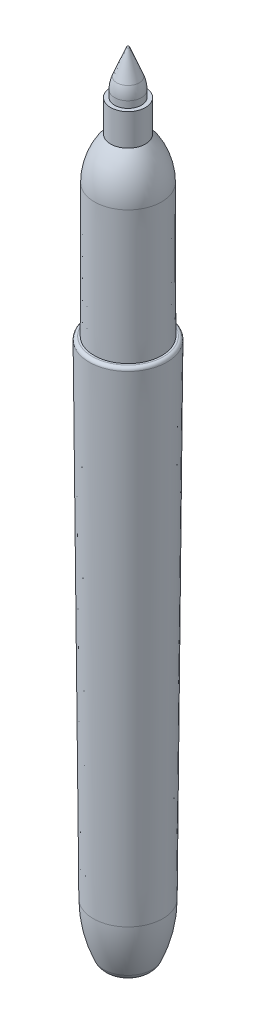
ISO-10303-21;
HEADER;
FILE_DESCRIPTION(('STEP AP214'),'2;1');
FILE_NAME('part.step','',(''),(''),'','','');
FILE_SCHEMA(('AUTOMOTIVE_DESIGN { 1 0 10303 214 1 1 1 1 }'));
ENDSEC;
DATA;
#1=APPLICATION_CONTEXT('core data for automotive mechanical design processes');
#2=APPLICATION_PROTOCOL_DEFINITION('international standard','automotive_design',2000,#1);
#3=PRODUCT_CONTEXT('',#1,'mechanical');
#4=PRODUCT('Part','Part','',(#3));
#5=PRODUCT_RELATED_PRODUCT_CATEGORY('part','',(#4));
#6=PRODUCT_DEFINITION_FORMATION('','',#4);
#7=PRODUCT_DEFINITION_CONTEXT('part definition',#1,'design');
#8=PRODUCT_DEFINITION('design','',#6,#7);
#9=PRODUCT_DEFINITION_SHAPE('','',#8);
#10=(LENGTH_UNIT() NAMED_UNIT(*) SI_UNIT(.MILLI.,.METRE.));
#11=(NAMED_UNIT(*) PLANE_ANGLE_UNIT() SI_UNIT($,.RADIAN.));
#12=(NAMED_UNIT(*) SI_UNIT($,.STERADIAN.) SOLID_ANGLE_UNIT());
#13=UNCERTAINTY_MEASURE_WITH_UNIT(LENGTH_MEASURE(1.E-05),#10,'distance_accuracy_value','');
#14=(GEOMETRIC_REPRESENTATION_CONTEXT(3) GLOBAL_UNCERTAINTY_ASSIGNED_CONTEXT((#13)) GLOBAL_UNIT_ASSIGNED_CONTEXT((#10,
#11,#12)) REPRESENTATION_CONTEXT('',''));
#15=CARTESIAN_POINT('',(0.,0.,0.));
#16=DIRECTION('',(0.,0.,1.));
#17=DIRECTION('',(1.,0.,0.));
#18=AXIS2_PLACEMENT_3D('',#15,#16,#17);
#19=CARTESIAN_POINT('',(0.,0.,0.));
#20=DIRECTION('',(0.,-1.,0.));
#21=DIRECTION('',(0.,0.,-1.));
#22=AXIS2_PLACEMENT_3D('',#19,#20,#21);
#23=PLANE('',#22);
#24=CARTESIAN_POINT('',(0.,0.,0.));
#25=DIRECTION('',(0.,-1.,0.));
#26=DIRECTION('',(0.,0.,-1.));
#27=AXIS2_PLACEMENT_3D('',#24,#25,#26);
#28=CIRCLE('',#27,2.011555844);
#29=CARTESIAN_POINT('',(0.,0.,-2.011555844));
#30=VERTEX_POINT('',#29);
#31=EDGE_CURVE('E10',#30,#30,#28,.T.);
#32=ORIENTED_EDGE('',*,*,#31,.T.);
#33=EDGE_LOOP('',(#32));
#34=FACE_BOUND('',#33,.T.);
#35=ADVANCED_FACE('F16',(#34),#23,.T.);
#36=CARTESIAN_POINT('',(0.,9.1688251537,0.));
#37=DIRECTION('',(0.,-1.,0.));
#38=DIRECTION('',(0.,0.,1.));
#39=AXIS2_PLACEMENT_3D('',#36,#37,#38);
#40=DEGENERATE_TOROIDAL_SURFACE('',#39,14.499287439,20.,.F.);
#41=CARTESIAN_POINT('',(0.,1.2034638718,0.));
#42=DIRECTION('',(0.,1.,0.));
#43=DIRECTION('',(0.,0.,1.));
#44=AXIS2_PLACEMENT_3D('',#41,#42,#43);
#45=CIRCLE('',#44,3.8460939866);
#46=CARTESIAN_POINT('',(0.,1.2034638718,3.8460939866));
#47=VERTEX_POINT('',#46);
#48=EDGE_CURVE('E26',#47,#47,#45,.T.);
#49=ORIENTED_EDGE('',*,*,#48,.T.);
#50=EDGE_LOOP('',(#49));
#51=FACE_BOUND('',#50,.T.);
#52=CARTESIAN_POINT('',(0.,9.,0.));
#53=DIRECTION('',(0.,-1.,0.));
#54=DIRECTION('',(0.,0.,-1.));
#55=AXIS2_PLACEMENT_3D('',#52,#53,#54);
#56=CIRCLE('',#55,5.5);
#57=CARTESIAN_POINT('',(0.,9.,-5.5));
#58=VERTEX_POINT('',#57);
#59=EDGE_CURVE('E81',#58,#58,#56,.T.);
#60=ORIENTED_EDGE('',*,*,#59,.T.);
#61=EDGE_LOOP('',(#60));
#62=FACE_BOUND('',#61,.T.);
#63=ADVANCED_FACE('F168',(#51,#62),#40,.F.);
#64=CARTESIAN_POINT('',(0.,9.,0.));
#65=DIRECTION('',(0.,1.,0.));
#66=DIRECTION('',(0.,0.,1.));
#67=AXIS2_PLACEMENT_3D('',#64,#65,#66);
#68=CONICAL_SURFACE('',#67,5.5,0.00844135790000477);
#69=CARTESIAN_POINT('',(0.,85.4877118411,0.));
#70=DIRECTION('',(0.,-1.,0.));
#71=DIRECTION('',(0.,0.,-1.));
#72=AXIS2_PLACEMENT_3D('',#69,#70,#71);
#73=CIRCLE('',#72,6.1456754896);
#74=CARTESIAN_POINT('',(0.,85.4877118411,-6.1456754896));
#75=VERTEX_POINT('',#74);
#76=EDGE_CURVE('E85',#75,#75,#73,.T.);
#77=ORIENTED_EDGE('',*,*,#76,.T.);
#78=EDGE_LOOP('',(#77));
#79=FACE_BOUND('',#78,.T.);
#80=ORIENTED_EDGE('',*,*,#59,.F.);
#81=EDGE_LOOP('',(#80));
#82=FACE_BOUND('',#81,.T.);
#83=ADVANCED_FACE('F82',(#79,#82),#68,.T.);
#84=CARTESIAN_POINT('',(0.,85.492,0.));
#85=DIRECTION('',(0.,-1.,0.));
#86=DIRECTION('',(0.,0.,-1.));
#87=AXIS2_PLACEMENT_3D('',#84,#85,#86);
#88=TOROIDAL_SURFACE('',#87,5.6376935886,0.508);
#89=CARTESIAN_POINT('',(0.,86.,0.));
#90=DIRECTION('',(0.,-1.,0.));
#91=DIRECTION('',(0.,0.,-1.));
#92=AXIS2_PLACEMENT_3D('',#89,#90,#91);
#93=CIRCLE('',#92,5.6376935886);
#94=CARTESIAN_POINT('',(0.,86.,-5.6376935886));
#95=VERTEX_POINT('',#94);
#96=EDGE_CURVE('E95',#95,#95,#93,.T.);
#97=ORIENTED_EDGE('',*,*,#96,.T.);
#98=EDGE_LOOP('',(#97));
#99=FACE_BOUND('',#98,.T.);
#100=ORIENTED_EDGE('',*,*,#76,.F.);
#101=EDGE_LOOP('',(#100));
#102=FACE_BOUND('',#101,.T.);
#103=ADVANCED_FACE('F180',(#99,#102),#88,.T.);
#104=CARTESIAN_POINT('',(5.6376935886,86.,0.));
#105=DIRECTION('',(0.,1.,0.));
#106=DIRECTION('',(1.,0.,0.));
#107=AXIS2_PLACEMENT_3D('',#104,#105,#106);
#108=PLANE('',#107);
#109=CARTESIAN_POINT('',(0.,86.,0.));
#110=DIRECTION('',(0.,-1.,0.));
#111=DIRECTION('',(0.,0.,-1.));
#112=AXIS2_PLACEMENT_3D('',#109,#110,#111);
#113=CIRCLE('',#112,5.35);
#114=CARTESIAN_POINT('',(0.,86.,-5.35));
#115=VERTEX_POINT('',#114);
#116=EDGE_CURVE('E130',#115,#115,#113,.T.);
#117=ORIENTED_EDGE('',*,*,#116,.T.);
#118=EDGE_LOOP('',(#117));
#119=FACE_BOUND('',#118,.T.);
#120=ORIENTED_EDGE('',*,*,#96,.F.);
#121=EDGE_LOOP('',(#120));
#122=FACE_BOUND('',#121,.T.);
#123=ADVANCED_FACE('F201',(#119,#122),#108,.T.);
#124=CARTESIAN_POINT('',(0.,86.,0.));
#125=DIRECTION('',(0.,-1.,0.));
#126=DIRECTION('',(0.,0.,-1.));
#127=AXIS2_PLACEMENT_3D('',#124,#125,#126);
#128=CONICAL_SURFACE('',#127,5.35,0.00238094790002299);
#129=CARTESIAN_POINT('',(0.,107.,0.));
#130=DIRECTION('',(0.,-1.,0.));
#131=DIRECTION('',(0.,0.,-1.));
#132=AXIS2_PLACEMENT_3D('',#129,#130,#131);
#133=CIRCLE('',#132,5.3);
#134=CARTESIAN_POINT('',(0.,107.,-5.3));
#135=VERTEX_POINT('',#134);
#136=EDGE_CURVE('E133',#135,#135,#133,.T.);
#137=ORIENTED_EDGE('',*,*,#136,.T.);
#138=EDGE_LOOP('',(#137));
#139=FACE_BOUND('',#138,.T.);
#140=ORIENTED_EDGE('',*,*,#116,.F.);
#141=EDGE_LOOP('',(#140));
#142=FACE_BOUND('',#141,.T.);
#143=ADVANCED_FACE('F164',(#139,#142),#128,.T.);
#144=CARTESIAN_POINT('',(0.,106.9761709024,0.));
#145=DIRECTION('',(0.,-1.,0.));
#146=DIRECTION('',(0.,0.,1.));
#147=AXIS2_PLACEMENT_3D('',#144,#145,#146);
#148=DEGENERATE_TOROIDAL_SURFACE('',#147,4.7082209799,10.0082493479,.F.);
#149=CARTESIAN_POINT('',(0.,113.65,0.));
#150=DIRECTION('',(0.,-1.,0.));
#151=DIRECTION('',(0.,0.,-1.));
#152=AXIS2_PLACEMENT_3D('',#149,#150,#151);
#153=CIRCLE('',#152,2.75);
#154=CARTESIAN_POINT('',(0.,113.65,-2.75));
#155=VERTEX_POINT('',#154);
#156=EDGE_CURVE('E109',#155,#155,#153,.T.);
#157=ORIENTED_EDGE('',*,*,#156,.T.);
#158=EDGE_LOOP('',(#157));
#159=FACE_BOUND('',#158,.T.);
#160=ORIENTED_EDGE('',*,*,#136,.F.);
#161=EDGE_LOOP('',(#160));
#162=FACE_BOUND('',#161,.T.);
#163=ADVANCED_FACE('F147',(#159,#162),#148,.F.);
#164=CARTESIAN_POINT('',(0.,0.,0.));
#165=DIRECTION('',(0.,-1.,0.));
#166=DIRECTION('',(0.,0.,-1.));
#167=AXIS2_PLACEMENT_3D('',#164,#165,#166);
#168=CYLINDRICAL_SURFACE('',#167,2.75);
#169=CARTESIAN_POINT('',(0.,118.65,0.));
#170=DIRECTION('',(0.,-1.,0.));
#171=DIRECTION('',(0.,0.,-1.));
#172=AXIS2_PLACEMENT_3D('',#169,#170,#171);
#173=CIRCLE('',#172,2.75);
#174=CARTESIAN_POINT('',(0.,118.65,-2.75));
#175=VERTEX_POINT('',#174);
#176=EDGE_CURVE('E19',#175,#175,#173,.T.);
#177=ORIENTED_EDGE('',*,*,#176,.T.);
#178=EDGE_LOOP('',(#177));
#179=FACE_BOUND('',#178,.T.);
#180=ORIENTED_EDGE('',*,*,#156,.F.);
#181=EDGE_LOOP('',(#180));
#182=FACE_BOUND('',#181,.T.);
#183=ADVANCED_FACE('F150',(#179,#182),#168,.T.);
#184=CARTESIAN_POINT('',(2.75,118.65,0.));
#185=DIRECTION('',(0.,1.,0.));
#186=DIRECTION('',(1.,0.,0.));
#187=AXIS2_PLACEMENT_3D('',#184,#185,#186);
#188=PLANE('',#187);
#189=CARTESIAN_POINT('',(0.,118.65,0.));
#190=DIRECTION('',(0.,1.,0.));
#191=DIRECTION('',(0.,0.,1.));
#192=AXIS2_PLACEMENT_3D('',#189,#190,#191);
#193=CIRCLE('',#192,2.125);
#194=CARTESIAN_POINT('',(0.,118.65,2.125));
#195=VERTEX_POINT('',#194);
#196=EDGE_CURVE('E98',#195,#195,#193,.T.);
#197=ORIENTED_EDGE('',*,*,#196,.F.);
#198=EDGE_LOOP('',(#197));
#199=FACE_BOUND('',#198,.T.);
#200=ORIENTED_EDGE('',*,*,#176,.F.);
#201=EDGE_LOOP('',(#200));
#202=FACE_BOUND('',#201,.T.);
#203=ADVANCED_FACE('F152',(#199,#202),#188,.T.);
#204=CARTESIAN_POINT('',(0.,2.,0.));
#205=DIRECTION('',(0.,-1.,0.));
#206=DIRECTION('',(0.,0.,-1.));
#207=AXIS2_PLACEMENT_3D('',#204,#205,#206);
#208=TOROIDAL_SURFACE('',#207,2.011555844,2.);
#209=ORIENTED_EDGE('',*,*,#48,.F.);
#210=EDGE_LOOP('',(#209));
#211=FACE_BOUND('',#210,.T.);
#212=ORIENTED_EDGE('',*,*,#31,.F.);
#213=EDGE_LOOP('',(#212));
#214=FACE_BOUND('',#213,.T.);
#215=ADVANCED_FACE('F161',(#211,#214),#208,.T.);
#216=CARTESIAN_POINT('',(0.,118.65,0.));
#217=DIRECTION('',(0.,-1.,0.));
#218=DIRECTION('',(0.,0.,-1.));
#219=AXIS2_PLACEMENT_3D('',#216,#217,#218);
#220=CYLINDRICAL_SURFACE('',#219,2.125);
#221=CARTESIAN_POINT('',(0.,119.6918627643,0.));
#222=DIRECTION('',(0.,-1.,0.));
#223=DIRECTION('',(0.,0.,1.));
#224=AXIS2_PLACEMENT_3D('',#221,#222,#223);
#225=CIRCLE('',#224,2.125);
#226=CARTESIAN_POINT('',(0.,119.6918627643,2.125));
#227=VERTEX_POINT('',#226);
#228=EDGE_CURVE('E100',#227,#227,#225,.T.);
#229=ORIENTED_EDGE('',*,*,#228,.T.);
#230=EDGE_LOOP('',(#229));
#231=FACE_BOUND('',#230,.T.);
#232=ORIENTED_EDGE('',*,*,#196,.T.);
#233=EDGE_LOOP('',(#232));
#234=FACE_BOUND('',#233,.T.);
#235=ADVANCED_FACE('F185',(#231,#234),#220,.T.);
#236=CARTESIAN_POINT('',(0.,120.65,0.));
#237=DIRECTION('',(0.,-1.,0.));
#238=DIRECTION('',(0.,0.,-1.));
#239=AXIS2_PLACEMENT_3D('',#236,#237,#238);
#240=CONICAL_SURFACE('',#239,2.125,0.3786644398);
#241=CARTESIAN_POINT('',(0.,121.5402620215,0.));
#242=DIRECTION('',(0.,1.,0.));
#243=DIRECTION('',(0.,0.,1.));
#244=AXIS2_PLACEMENT_3D('',#241,#242,#243);
#245=CIRCLE('',#244,1.7707959691);
#246=CARTESIAN_POINT('',(0.,121.5402620215,1.7707959691));
#247=VERTEX_POINT('',#246);
#248=EDGE_CURVE('E111',#247,#247,#245,.T.);
#249=ORIENTED_EDGE('',*,*,#248,.T.);
#250=EDGE_LOOP('',(#249));
#251=FACE_BOUND('',#250,.T.);
#252=CARTESIAN_POINT('',(0.,125.5239359703,0.));
#253=DIRECTION('',(0.,-1.,0.));
#254=DIRECTION('',(0.,0.,-1.));
#255=AXIS2_PLACEMENT_3D('',#252,#253,#254);
#256=CIRCLE('',#255,0.1858318388);
#257=CARTESIAN_POINT('',(0.,125.5239359703,-0.1858318388));
#258=VERTEX_POINT('',#257);
#259=EDGE_CURVE('E117',#258,#258,#256,.T.);
#260=ORIENTED_EDGE('',*,*,#259,.T.);
#261=EDGE_LOOP('',(#260));
#262=FACE_BOUND('',#261,.T.);
#263=ADVANCED_FACE('F187',(#251,#262),#240,.T.);
#264=CARTESIAN_POINT('',(0.,125.45,0.));
#265=DIRECTION('',(0.,-1.,0.));
#266=DIRECTION('',(1.,0.,0.));
#267=AXIS2_PLACEMENT_3D('',#264,#265,#266);
#268=SPHERICAL_SURFACE('',#267,0.2);
#269=ORIENTED_EDGE('',*,*,#259,.F.);
#270=EDGE_LOOP('',(#269));
#271=FACE_BOUND('',#270,.T.);
#272=ADVANCED_FACE('F189',(#271),#268,.T.);
#273=CARTESIAN_POINT('',(0.,119.6918627643,0.));
#274=DIRECTION('',(0.,1.,0.));
#275=DIRECTION('',(0.,0.,-1.));
#276=AXIS2_PLACEMENT_3D('',#273,#274,#275);
#277=DEGENERATE_TOROIDAL_SURFACE('',#276,2.875,5.,.F.);
#278=ORIENTED_EDGE('',*,*,#248,.F.);
#279=EDGE_LOOP('',(#278));
#280=FACE_BOUND('',#279,.T.);
#281=ORIENTED_EDGE('',*,*,#228,.F.);
#282=EDGE_LOOP('',(#281));
#283=FACE_BOUND('',#282,.T.);
#284=ADVANCED_FACE('F192',(#280,#283),#277,.F.);
#285=CLOSED_SHELL('',(#35,#63,#83,#103,#123,#143,#163,#183,#203,#215,#235,#263,#272,#284));
#286=MANIFOLD_SOLID_BREP('B1',#285);
#287=ADVANCED_BREP_SHAPE_REPRESENTATION('',(#18,#286),#14);
#288=SHAPE_DEFINITION_REPRESENTATION(#9,#287);
ENDSEC;
END-ISO-10303-21;
